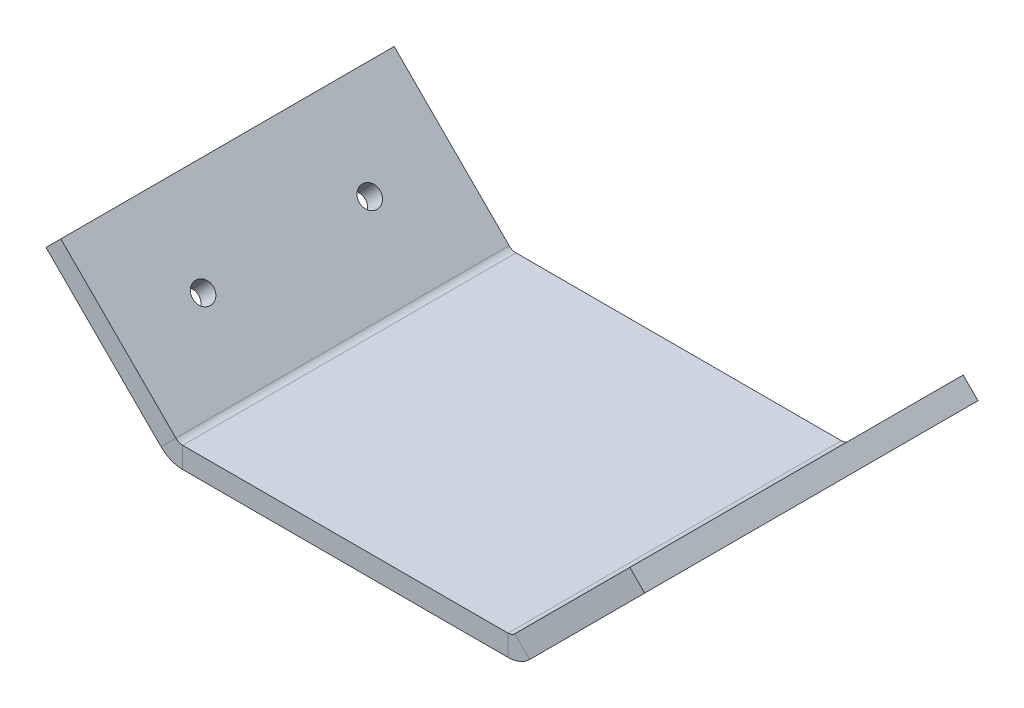
ISO-10303-21;
HEADER;
FILE_DESCRIPTION(('STEP AP214'),'2;1');
FILE_NAME('part.step','',(''),(''),'','','');
FILE_SCHEMA(('AUTOMOTIVE_DESIGN { 1 0 10303 214 1 1 1 1 }'));
ENDSEC;
DATA;
#1=APPLICATION_CONTEXT('core data for automotive mechanical design processes');
#2=APPLICATION_PROTOCOL_DEFINITION('international standard','automotive_design',2000,#1);
#3=PRODUCT_CONTEXT('',#1,'mechanical');
#4=PRODUCT('Part','Part','',(#3));
#5=PRODUCT_RELATED_PRODUCT_CATEGORY('part','',(#4));
#6=PRODUCT_DEFINITION_FORMATION('','',#4);
#7=PRODUCT_DEFINITION_CONTEXT('part definition',#1,'design');
#8=PRODUCT_DEFINITION('design','',#6,#7);
#9=PRODUCT_DEFINITION_SHAPE('','',#8);
#10=(LENGTH_UNIT() NAMED_UNIT(*) SI_UNIT(.MILLI.,.METRE.));
#11=(NAMED_UNIT(*) PLANE_ANGLE_UNIT() SI_UNIT($,.RADIAN.));
#12=(NAMED_UNIT(*) SI_UNIT($,.STERADIAN.) SOLID_ANGLE_UNIT());
#13=UNCERTAINTY_MEASURE_WITH_UNIT(LENGTH_MEASURE(1.E-05),#10,'distance_accuracy_value','');
#14=(GEOMETRIC_REPRESENTATION_CONTEXT(3) GLOBAL_UNCERTAINTY_ASSIGNED_CONTEXT((#13)) GLOBAL_UNIT_ASSIGNED_CONTEXT((#10,
#11,#12)) REPRESENTATION_CONTEXT('',''));
#15=CARTESIAN_POINT('',(0.,0.,0.));
#16=DIRECTION('',(0.,0.,1.));
#17=DIRECTION('',(1.,0.,0.));
#18=AXIS2_PLACEMENT_3D('',#15,#16,#17);
#19=CARTESIAN_POINT('',(-12.7,1.6002,12.7));
#20=DIRECTION('',(0.,0.,-1.));
#21=DIRECTION('',(-1.,0.,0.));
#22=AXIS2_PLACEMENT_3D('',#19,#20,#21);
#23=PLANE('',#22);
#24=DIRECTION('',(0.,-1.,0.));
#25=VECTOR('',#24,1.);
#26=CARTESIAN_POINT('',(-12.394890289956,1.60020000000001,12.7));
#27=LINE('',#26,#25);
#28=CARTESIAN_POINT('',(-12.394890289956,1.6002,12.7));
#29=VERTEX_POINT('',#28);
#30=CARTESIAN_POINT('',(-12.394890289956,0.,12.7));
#31=VERTEX_POINT('',#30);
#32=EDGE_CURVE('E177',#29,#31,#27,.T.);
#33=ORIENTED_EDGE('',*,*,#32,.T.);
#34=DIRECTION('',(1.,0.,0.));
#35=VECTOR('',#34,1.);
#36=CARTESIAN_POINT('',(-12.7,0.,12.7));
#37=LINE('',#36,#35);
#38=CARTESIAN_POINT('',(12.394890289956,0.,12.7));
#39=VERTEX_POINT('',#38);
#40=EDGE_CURVE('E237',#31,#39,#37,.T.);
#41=ORIENTED_EDGE('',*,*,#40,.T.);
#42=DIRECTION('',(0.,-1.,0.));
#43=VECTOR('',#42,1.);
#44=CARTESIAN_POINT('',(12.394890289956,1.6002,12.7));
#45=LINE('',#44,#43);
#46=CARTESIAN_POINT('',(12.394890289956,1.6002,12.7));
#47=VERTEX_POINT('',#46);
#48=EDGE_CURVE('E234',#47,#39,#45,.T.);
#49=ORIENTED_EDGE('',*,*,#48,.F.);
#50=DIRECTION('',(1.,0.,0.));
#51=VECTOR('',#50,1.);
#52=CARTESIAN_POINT('',(-12.7,1.6002,12.7));
#53=LINE('',#52,#51);
#54=EDGE_CURVE('E41',#29,#47,#53,.T.);
#55=ORIENTED_EDGE('',*,*,#54,.F.);
#56=EDGE_LOOP('',(#33,#41,#49,#55));
#57=FACE_BOUND('',#56,.T.);
#58=ADVANCED_FACE('F33',(#57),#23,.F.);
#59=CARTESIAN_POINT('',(-12.7,1.6002,-12.7));
#60=DIRECTION('',(0.,0.,1.));
#61=DIRECTION('',(1.,0.,0.));
#62=AXIS2_PLACEMENT_3D('',#59,#60,#61);
#63=PLANE('',#62);
#64=DIRECTION('',(0.,-1.,0.));
#65=VECTOR('',#64,1.);
#66=CARTESIAN_POINT('',(-12.394890289956,1.6002,-12.7));
#67=LINE('',#66,#65);
#68=CARTESIAN_POINT('',(-12.394890289956,1.6002,-12.7));
#69=VERTEX_POINT('',#68);
#70=CARTESIAN_POINT('',(-12.394890289956,0.,-12.7));
#71=VERTEX_POINT('',#70);
#72=EDGE_CURVE('E49',#69,#71,#67,.T.);
#73=ORIENTED_EDGE('',*,*,#72,.F.);
#74=DIRECTION('',(-1.,0.,0.));
#75=VECTOR('',#74,1.);
#76=CARTESIAN_POINT('',(-12.7,1.6002,-12.7));
#77=LINE('',#76,#75);
#78=CARTESIAN_POINT('',(12.394890289956,1.6002,-12.7));
#79=VERTEX_POINT('',#78);
#80=EDGE_CURVE('E11',#79,#69,#77,.T.);
#81=ORIENTED_EDGE('',*,*,#80,.F.);
#82=DIRECTION('',(0.,-1.,0.));
#83=VECTOR('',#82,1.);
#84=CARTESIAN_POINT('',(12.394890289956,1.6002,-12.7));
#85=LINE('',#84,#83);
#86=CARTESIAN_POINT('',(12.394890289956,0.,-12.7));
#87=VERTEX_POINT('',#86);
#88=EDGE_CURVE('E223',#79,#87,#85,.T.);
#89=ORIENTED_EDGE('',*,*,#88,.T.);
#90=DIRECTION('',(-1.,0.,0.));
#91=VECTOR('',#90,1.);
#92=CARTESIAN_POINT('',(-12.7,0.,-12.7));
#93=LINE('',#92,#91);
#94=EDGE_CURVE('E36',#87,#71,#93,.T.);
#95=ORIENTED_EDGE('',*,*,#94,.T.);
#96=EDGE_LOOP('',(#73,#81,#89,#95));
#97=FACE_BOUND('',#96,.T.);
#98=ADVANCED_FACE('F243',(#97),#63,.F.);
#99=CARTESIAN_POINT('',(-12.7,1.6002,12.7));
#100=DIRECTION('',(0.,1.,0.));
#101=DIRECTION('',(0.,0.,1.));
#102=AXIS2_PLACEMENT_3D('',#99,#100,#101);
#103=PLANE('',#102);
#104=ORIENTED_EDGE('',*,*,#80,.T.);
#105=DIRECTION('',(0.,0.,1.));
#106=VECTOR('',#105,1.);
#107=CARTESIAN_POINT('',(-12.394890289956,1.60020000000001,12.7));
#108=LINE('',#107,#106);
#109=EDGE_CURVE('E55',#29,#69,#108,.F.);
#110=ORIENTED_EDGE('',*,*,#109,.F.);
#111=ORIENTED_EDGE('',*,*,#54,.T.);
#112=DIRECTION('',(0.,0.,-1.));
#113=VECTOR('',#112,1.);
#114=CARTESIAN_POINT('',(12.394890289956,1.6002,-12.7));
#115=LINE('',#114,#113);
#116=EDGE_CURVE('E229',#79,#47,#115,.F.);
#117=ORIENTED_EDGE('',*,*,#116,.F.);
#118=EDGE_LOOP('',(#104,#110,#111,#117));
#119=FACE_BOUND('',#118,.T.);
#120=ADVANCED_FACE('F282',(#119),#103,.T.);
#121=CARTESIAN_POINT('',(-12.7,0.,12.7));
#122=DIRECTION('',(0.,1.,0.));
#123=DIRECTION('',(0.,0.,1.));
#124=AXIS2_PLACEMENT_3D('',#121,#122,#123);
#125=PLANE('',#124);
#126=DIRECTION('',(0.,0.,1.));
#127=VECTOR('',#126,1.);
#128=CARTESIAN_POINT('',(-12.394890289956,0.,12.7));
#129=LINE('',#128,#127);
#130=EDGE_CURVE('E131',#31,#71,#129,.F.);
#131=ORIENTED_EDGE('',*,*,#130,.T.);
#132=ORIENTED_EDGE('',*,*,#94,.F.);
#133=DIRECTION('',(0.,0.,-1.));
#134=VECTOR('',#133,1.);
#135=CARTESIAN_POINT('',(12.394890289956,0.,-12.7));
#136=LINE('',#135,#134);
#137=EDGE_CURVE('E216',#87,#39,#136,.F.);
#138=ORIENTED_EDGE('',*,*,#137,.T.);
#139=ORIENTED_EDGE('',*,*,#40,.F.);
#140=EDGE_LOOP('',(#131,#132,#138,#139));
#141=FACE_BOUND('',#140,.T.);
#142=ADVANCED_FACE('F283',(#141),#125,.F.);
#143=CARTESIAN_POINT('',(12.394890289956,2.3368,12.7));
#144=DIRECTION('',(0.,0.,1.));
#145=DIRECTION('',(1.,0.,0.));
#146=AXIS2_PLACEMENT_3D('',#143,#144,#145);
#147=PLANE('',#146);
#148=DIRECTION('',(0.707106781186544,-0.707106781186551,0.));
#149=VECTOR('',#148,1.);
#150=CARTESIAN_POINT('',(12.915745144978,1.81594514497799,12.7));
#151=LINE('',#150,#149);
#152=CARTESIAN_POINT('',(12.915745144978,1.81594514497799,12.7));
#153=VERTEX_POINT('',#152);
#154=CARTESIAN_POINT('',(14.0472574162327,0.684432873723268,12.7));
#155=VERTEX_POINT('',#154);
#156=EDGE_CURVE('E184',#153,#155,#151,.T.);
#157=ORIENTED_EDGE('',*,*,#156,.F.);
#158=CARTESIAN_POINT('',(12.394890289956,2.3368,12.7));
#159=DIRECTION('',(0.,0.,-1.));
#160=DIRECTION('',(-1.,0.,0.));
#161=AXIS2_PLACEMENT_3D('',#158,#159,#160);
#162=CIRCLE('',#161,0.736599999999999);
#163=EDGE_CURVE('E226',#47,#153,#162,.F.);
#164=ORIENTED_EDGE('',*,*,#163,.F.);
#165=ORIENTED_EDGE('',*,*,#48,.T.);
#166=CARTESIAN_POINT('',(12.394890289956,2.3368,12.7));
#167=DIRECTION('',(0.,0.,-1.));
#168=DIRECTION('',(-1.,0.,0.));
#169=AXIS2_PLACEMENT_3D('',#166,#167,#168);
#170=CIRCLE('',#169,2.3368);
#171=EDGE_CURVE('E219',#39,#155,#170,.F.);
#172=ORIENTED_EDGE('',*,*,#171,.T.);
#173=EDGE_LOOP('',(#157,#164,#165,#172));
#174=FACE_BOUND('',#173,.T.);
#175=ADVANCED_FACE('F288',(#174),#147,.T.);
#176=CARTESIAN_POINT('',(12.394890289956,2.3368,-12.7));
#177=DIRECTION('',(0.,0.,1.));
#178=DIRECTION('',(1.,0.,0.));
#179=AXIS2_PLACEMENT_3D('',#176,#177,#178);
#180=PLANE('',#179);
#181=CARTESIAN_POINT('',(12.394890289956,2.3368,-12.7));
#182=DIRECTION('',(0.,0.,-1.));
#183=DIRECTION('',(-1.,0.,0.));
#184=AXIS2_PLACEMENT_3D('',#181,#182,#183);
#185=CIRCLE('',#184,0.736599999999999);
#186=CARTESIAN_POINT('',(12.915745144978,1.81594514497799,-12.7));
#187=VERTEX_POINT('',#186);
#188=EDGE_CURVE('E215',#187,#79,#185,.T.);
#189=ORIENTED_EDGE('',*,*,#188,.F.);
#190=DIRECTION('',(0.707106781186544,-0.707106781186551,0.));
#191=VECTOR('',#190,1.);
#192=CARTESIAN_POINT('',(12.915745144978,1.81594514497799,-12.7));
#193=LINE('',#192,#191);
#194=CARTESIAN_POINT('',(14.0472574162327,0.684432873723268,-12.7));
#195=VERTEX_POINT('',#194);
#196=EDGE_CURVE('E188',#187,#195,#193,.T.);
#197=ORIENTED_EDGE('',*,*,#196,.T.);
#198=CARTESIAN_POINT('',(12.394890289956,2.3368,-12.7));
#199=DIRECTION('',(0.,0.,-1.));
#200=DIRECTION('',(-1.,0.,0.));
#201=AXIS2_PLACEMENT_3D('',#198,#199,#200);
#202=CIRCLE('',#201,2.3368);
#203=EDGE_CURVE('E220',#195,#87,#202,.T.);
#204=ORIENTED_EDGE('',*,*,#203,.T.);
#205=ORIENTED_EDGE('',*,*,#88,.F.);
#206=EDGE_LOOP('',(#189,#197,#204,#205));
#207=FACE_BOUND('',#206,.T.);
#208=ADVANCED_FACE('F334',(#207),#180,.F.);
#209=CARTESIAN_POINT('',(12.394890289956,2.3368,-12.7));
#210=DIRECTION('',(0.,0.,-1.));
#211=DIRECTION('',(0.707106781186544,-0.707106781186551,0.));
#212=AXIS2_PLACEMENT_3D('',#209,#210,#211);
#213=CYLINDRICAL_SURFACE('',#212,2.3368);
#214=ORIENTED_EDGE('',*,*,#137,.F.);
#215=ORIENTED_EDGE('',*,*,#203,.F.);
#216=DIRECTION('',(0.,0.,1.));
#217=VECTOR('',#216,1.);
#218=CARTESIAN_POINT('',(14.0472574162327,0.684432873723268,-12.7));
#219=LINE('',#218,#217);
#220=EDGE_CURVE('E191',#195,#155,#219,.T.);
#221=ORIENTED_EDGE('',*,*,#220,.T.);
#222=ORIENTED_EDGE('',*,*,#171,.F.);
#223=EDGE_LOOP('',(#214,#215,#221,#222));
#224=FACE_BOUND('',#223,.T.);
#225=ADVANCED_FACE('F289',(#224),#213,.T.);
#226=CARTESIAN_POINT('',(12.394890289956,2.3368,-12.7));
#227=DIRECTION('',(0.,0.,-1.));
#228=DIRECTION('',(0.707106781186544,-0.707106781186551,0.));
#229=AXIS2_PLACEMENT_3D('',#226,#227,#228);
#230=CYLINDRICAL_SURFACE('',#229,0.736599999999999);
#231=ORIENTED_EDGE('',*,*,#116,.T.);
#232=ORIENTED_EDGE('',*,*,#163,.T.);
#233=DIRECTION('',(0.,0.,-1.));
#234=VECTOR('',#233,1.);
#235=CARTESIAN_POINT('',(12.915745144978,1.81594514497799,12.7));
#236=LINE('',#235,#234);
#237=EDGE_CURVE('E186',#153,#187,#236,.T.);
#238=ORIENTED_EDGE('',*,*,#237,.T.);
#239=ORIENTED_EDGE('',*,*,#188,.T.);
#240=EDGE_LOOP('',(#231,#232,#238,#239));
#241=FACE_BOUND('',#240,.T.);
#242=ADVANCED_FACE('F310',(#241),#230,.F.);
#243=CARTESIAN_POINT('',(22.8117683923239,9.44894384981439,-12.7));
#244=DIRECTION('',(0.,0.,1.));
#245=DIRECTION('',(1.,0.,0.));
#246=AXIS2_PLACEMENT_3D('',#243,#244,#245);
#247=PLANE('',#246);
#248=ORIENTED_EDGE('',*,*,#196,.F.);
#249=DIRECTION('',(0.707106781186551,0.707106781186544,0.));
#250=VECTOR('',#249,1.);
#251=CARTESIAN_POINT('',(21.6802561210692,10.5804561210691,-12.7));
#252=LINE('',#251,#250);
#253=CARTESIAN_POINT('',(21.6802561210692,10.5804561210691,-12.7));
#254=VERTEX_POINT('',#253);
#255=EDGE_CURVE('E195',#187,#254,#252,.T.);
#256=ORIENTED_EDGE('',*,*,#255,.T.);
#257=DIRECTION('',(-0.707106781186544,0.707106781186551,0.));
#258=VECTOR('',#257,1.);
#259=CARTESIAN_POINT('',(22.8117683923239,9.44894384981439,-12.7));
#260=LINE('',#259,#258);
#261=CARTESIAN_POINT('',(22.8117683923239,9.44894384981439,-12.7));
#262=VERTEX_POINT('',#261);
#263=EDGE_CURVE('E212',#262,#254,#260,.T.);
#264=ORIENTED_EDGE('',*,*,#263,.F.);
#265=DIRECTION('',(0.707106781186551,0.707106781186544,0.));
#266=VECTOR('',#265,1.);
#267=CARTESIAN_POINT('',(22.8117683923239,9.44894384981439,-12.7));
#268=LINE('',#267,#266);
#269=EDGE_CURVE('E196',#195,#262,#268,.T.);
#270=ORIENTED_EDGE('',*,*,#269,.F.);
#271=EDGE_LOOP('',(#248,#256,#264,#270));
#272=FACE_BOUND('',#271,.T.);
#273=ADVANCED_FACE('F298',(#272),#247,.F.);
#274=CARTESIAN_POINT('',(13.8315122712547,0.468687728745282,12.7));
#275=DIRECTION('',(0.,0.,-1.));
#276=DIRECTION('',(-1.,0.,0.));
#277=AXIS2_PLACEMENT_3D('',#274,#275,#276);
#278=PLANE('',#277);
#279=ORIENTED_EDGE('',*,*,#156,.T.);
#280=DIRECTION('',(-0.707106781186551,-0.707106781186544,0.));
#281=VECTOR('',#280,1.);
#282=CARTESIAN_POINT('',(13.8315122712547,0.468687728745282,12.7));
#283=LINE('',#282,#281);
#284=CARTESIAN_POINT('',(22.8117683923239,9.44894384981439,12.7));
#285=VERTEX_POINT('',#284);
#286=EDGE_CURVE('E201',#285,#155,#283,.T.);
#287=ORIENTED_EDGE('',*,*,#286,.F.);
#288=DIRECTION('',(-0.707106781186544,0.707106781186551,0.));
#289=VECTOR('',#288,1.);
#290=CARTESIAN_POINT('',(22.8117683923239,9.44894384981439,12.7));
#291=LINE('',#290,#289);
#292=CARTESIAN_POINT('',(21.6802561210692,10.5804561210691,12.7));
#293=VERTEX_POINT('',#292);
#294=EDGE_CURVE('E204',#285,#293,#291,.T.);
#295=ORIENTED_EDGE('',*,*,#294,.T.);
#296=DIRECTION('',(-0.707106781186551,-0.707106781186544,0.));
#297=VECTOR('',#296,1.);
#298=CARTESIAN_POINT('',(12.7,1.6002,12.7));
#299=LINE('',#298,#297);
#300=EDGE_CURVE('E199',#293,#153,#299,.T.);
#301=ORIENTED_EDGE('',*,*,#300,.T.);
#302=EDGE_LOOP('',(#279,#287,#295,#301));
#303=FACE_BOUND('',#302,.T.);
#304=ADVANCED_FACE('F307',(#303),#278,.F.);
#305=CARTESIAN_POINT('',(13.8315122712547,0.46868772874528,-12.7));
#306=DIRECTION('',(-0.707106781186544,0.707106781186551,0.));
#307=DIRECTION('',(-0.707106781186551,-0.707106781186544,0.));
#308=AXIS2_PLACEMENT_3D('',#305,#306,#307);
#309=PLANE('',#308);
#310=CARTESIAN_POINT('',(18.3216403317893,4.95881578927983,-6.35));
#311=DIRECTION('',(-0.707106781186544,0.707106781186551,0.));
#312=DIRECTION('',(-0.707106781186551,-0.707106781186544,0.));
#313=AXIS2_PLACEMENT_3D('',#310,#311,#312);
#314=CIRCLE('',#313,0.793749999999992);
#315=CARTESIAN_POINT('',(17.7603743242225,4.39754978171302,-6.35));
#316=VERTEX_POINT('',#315);
#317=EDGE_CURVE('E448',#316,#316,#314,.T.);
#318=ORIENTED_EDGE('',*,*,#317,.T.);
#319=EDGE_LOOP('',(#318));
#320=FACE_BOUND('',#319,.T.);
#321=CARTESIAN_POINT('',(18.3216403317893,4.95881578927983,6.35));
#322=DIRECTION('',(-0.707106781186544,0.707106781186551,0.));
#323=DIRECTION('',(-0.707106781186551,-0.707106781186544,0.));
#324=AXIS2_PLACEMENT_3D('',#321,#322,#323);
#325=CIRCLE('',#324,0.793749999999992);
#326=CARTESIAN_POINT('',(17.7603743242225,4.39754978171302,6.35));
#327=VERTEX_POINT('',#326);
#328=EDGE_CURVE('E442',#327,#327,#325,.T.);
#329=ORIENTED_EDGE('',*,*,#328,.T.);
#330=EDGE_LOOP('',(#329));
#331=FACE_BOUND('',#330,.T.);
#332=ORIENTED_EDGE('',*,*,#220,.F.);
#333=ORIENTED_EDGE('',*,*,#269,.T.);
#334=DIRECTION('',(0.,0.,1.));
#335=VECTOR('',#334,1.);
#336=CARTESIAN_POINT('',(22.8117683923239,9.44894384981439,12.7));
#337=LINE('',#336,#335);
#338=EDGE_CURVE('E198',#262,#285,#337,.T.);
#339=ORIENTED_EDGE('',*,*,#338,.T.);
#340=ORIENTED_EDGE('',*,*,#286,.T.);
#341=EDGE_LOOP('',(#332,#333,#339,#340));
#342=FACE_BOUND('',#341,.T.);
#343=ADVANCED_FACE('F293',(#320,#331,#342),#309,.F.);
#344=CARTESIAN_POINT('',(12.7,1.6002,-12.7));
#345=DIRECTION('',(-0.707106781186544,0.707106781186551,0.));
#346=DIRECTION('',(-0.707106781186551,-0.707106781186544,0.));
#347=AXIS2_PLACEMENT_3D('',#344,#345,#346);
#348=PLANE('',#347);
#349=CARTESIAN_POINT('',(17.1901280605346,6.09032806053455,-6.35));
#350=DIRECTION('',(-0.707106781186544,0.707106781186551,0.));
#351=DIRECTION('',(-0.707106781186551,-0.707106781186544,0.));
#352=AXIS2_PLACEMENT_3D('',#349,#350,#351);
#353=CIRCLE('',#352,0.793749999999987);
#354=CARTESIAN_POINT('',(16.6288620529678,5.52906205296774,-6.35));
#355=VERTEX_POINT('',#354);
#356=EDGE_CURVE('E451',#355,#355,#353,.T.);
#357=ORIENTED_EDGE('',*,*,#356,.F.);
#358=EDGE_LOOP('',(#357));
#359=FACE_BOUND('',#358,.T.);
#360=CARTESIAN_POINT('',(17.1901280605346,6.09032806053455,6.35));
#361=DIRECTION('',(-0.707106781186544,0.707106781186551,0.));
#362=DIRECTION('',(-0.707106781186551,-0.707106781186544,0.));
#363=AXIS2_PLACEMENT_3D('',#360,#361,#362);
#364=CIRCLE('',#363,0.793749999999987);
#365=CARTESIAN_POINT('',(16.6288620529678,5.52906205296774,6.35));
#366=VERTEX_POINT('',#365);
#367=EDGE_CURVE('E445',#366,#366,#364,.T.);
#368=ORIENTED_EDGE('',*,*,#367,.F.);
#369=EDGE_LOOP('',(#368));
#370=FACE_BOUND('',#369,.T.);
#371=ORIENTED_EDGE('',*,*,#255,.F.);
#372=ORIENTED_EDGE('',*,*,#237,.F.);
#373=ORIENTED_EDGE('',*,*,#300,.F.);
#374=DIRECTION('',(0.,0.,1.));
#375=VECTOR('',#374,1.);
#376=CARTESIAN_POINT('',(21.6802561210692,10.5804561210691,12.7));
#377=LINE('',#376,#375);
#378=EDGE_CURVE('E206',#254,#293,#377,.T.);
#379=ORIENTED_EDGE('',*,*,#378,.F.);
#380=EDGE_LOOP('',(#371,#372,#373,#379));
#381=FACE_BOUND('',#380,.T.);
#382=ADVANCED_FACE('F313',(#359,#370,#381),#348,.T.);
#383=CARTESIAN_POINT('',(22.8117683923239,9.44894384981439,12.7));
#384=DIRECTION('',(-0.707106781186551,-0.707106781186544,0.));
#385=DIRECTION('',(0.707106781186544,-0.707106781186551,0.));
#386=AXIS2_PLACEMENT_3D('',#383,#384,#385);
#387=PLANE('',#386);
#388=ORIENTED_EDGE('',*,*,#378,.T.);
#389=ORIENTED_EDGE('',*,*,#294,.F.);
#390=ORIENTED_EDGE('',*,*,#338,.F.);
#391=ORIENTED_EDGE('',*,*,#263,.T.);
#392=EDGE_LOOP('',(#388,#389,#390,#391));
#393=FACE_BOUND('',#392,.T.);
#394=ADVANCED_FACE('F304',(#393),#387,.F.);
#395=CARTESIAN_POINT('',(-12.394890289956,2.3368,-12.7));
#396=DIRECTION('',(0.,0.,-1.));
#397=DIRECTION('',(0.,1.,0.));
#398=AXIS2_PLACEMENT_3D('',#395,#396,#397);
#399=PLANE('',#398);
#400=DIRECTION('',(-0.707106781186544,-0.707106781186551,0.));
#401=VECTOR('',#400,1.);
#402=CARTESIAN_POINT('',(-12.915745144978,1.81594514497799,-12.7));
#403=LINE('',#402,#401);
#404=CARTESIAN_POINT('',(-12.915745144978,1.81594514497799,-12.7));
#405=VERTEX_POINT('',#404);
#406=CARTESIAN_POINT('',(-14.0472574162327,0.684432873723267,-12.7));
#407=VERTEX_POINT('',#406);
#408=EDGE_CURVE('E251',#405,#407,#403,.T.);
#409=ORIENTED_EDGE('',*,*,#408,.F.);
#410=CARTESIAN_POINT('',(-12.394890289956,2.3368,-12.7));
#411=DIRECTION('',(0.,0.,1.));
#412=DIRECTION('',(0.,-1.,0.));
#413=AXIS2_PLACEMENT_3D('',#410,#411,#412);
#414=CIRCLE('',#413,0.736599999999997);
#415=EDGE_CURVE('E134',#69,#405,#414,.F.);
#416=ORIENTED_EDGE('',*,*,#415,.F.);
#417=ORIENTED_EDGE('',*,*,#72,.T.);
#418=CARTESIAN_POINT('',(-12.394890289956,2.3368,-12.7));
#419=DIRECTION('',(0.,0.,1.));
#420=DIRECTION('',(0.,-1.,0.));
#421=AXIS2_PLACEMENT_3D('',#418,#419,#420);
#422=CIRCLE('',#421,2.3368);
#423=EDGE_CURVE('E176',#71,#407,#422,.F.);
#424=ORIENTED_EDGE('',*,*,#423,.T.);
#425=EDGE_LOOP('',(#409,#416,#417,#424));
#426=FACE_BOUND('',#425,.T.);
#427=ADVANCED_FACE('F249',(#426),#399,.T.);
#428=CARTESIAN_POINT('',(-12.394890289956,2.3368,12.7));
#429=DIRECTION('',(0.,0.,-1.));
#430=DIRECTION('',(0.,1.,0.));
#431=AXIS2_PLACEMENT_3D('',#428,#429,#430);
#432=PLANE('',#431);
#433=CARTESIAN_POINT('',(-12.394890289956,2.3368,12.7));
#434=DIRECTION('',(0.,0.,1.));
#435=DIRECTION('',(0.,-1.,0.));
#436=AXIS2_PLACEMENT_3D('',#433,#434,#435);
#437=CIRCLE('',#436,0.736599999999997);
#438=CARTESIAN_POINT('',(-12.915745144978,1.81594514497799,12.7));
#439=VERTEX_POINT('',#438);
#440=EDGE_CURVE('E141',#439,#29,#437,.T.);
#441=ORIENTED_EDGE('',*,*,#440,.F.);
#442=DIRECTION('',(-0.707106781186544,-0.707106781186551,0.));
#443=VECTOR('',#442,1.);
#444=CARTESIAN_POINT('',(-12.915745144978,1.81594514497799,12.7));
#445=LINE('',#444,#443);
#446=CARTESIAN_POINT('',(-14.0472574162327,0.68443287372327,12.7));
#447=VERTEX_POINT('',#446);
#448=EDGE_CURVE('E138',#439,#447,#445,.T.);
#449=ORIENTED_EDGE('',*,*,#448,.T.);
#450=CARTESIAN_POINT('',(-12.394890289956,2.3368,12.7));
#451=DIRECTION('',(0.,0.,1.));
#452=DIRECTION('',(0.,-1.,0.));
#453=AXIS2_PLACEMENT_3D('',#450,#451,#452);
#454=CIRCLE('',#453,2.3368);
#455=EDGE_CURVE('E124',#447,#31,#454,.T.);
#456=ORIENTED_EDGE('',*,*,#455,.T.);
#457=ORIENTED_EDGE('',*,*,#32,.F.);
#458=EDGE_LOOP('',(#441,#449,#456,#457));
#459=FACE_BOUND('',#458,.T.);
#460=ADVANCED_FACE('F139',(#459),#432,.F.);
#461=CARTESIAN_POINT('',(-12.394890289956,2.3368,12.7));
#462=DIRECTION('',(0.,0.,1.));
#463=DIRECTION('',(-0.707106781186544,-0.707106781186551,0.));
#464=AXIS2_PLACEMENT_3D('',#461,#462,#463);
#465=CYLINDRICAL_SURFACE('',#464,2.3368);
#466=ORIENTED_EDGE('',*,*,#130,.F.);
#467=ORIENTED_EDGE('',*,*,#455,.F.);
#468=DIRECTION('',(0.,0.,-1.));
#469=VECTOR('',#468,1.);
#470=CARTESIAN_POINT('',(-14.0472574162327,0.684432873723266,-12.7));
#471=LINE('',#470,#469);
#472=EDGE_CURVE('E129',#447,#407,#471,.T.);
#473=ORIENTED_EDGE('',*,*,#472,.T.);
#474=ORIENTED_EDGE('',*,*,#423,.F.);
#475=EDGE_LOOP('',(#466,#467,#473,#474));
#476=FACE_BOUND('',#475,.T.);
#477=ADVANCED_FACE('F126',(#476),#465,.T.);
#478=CARTESIAN_POINT('',(-12.394890289956,2.3368,12.7));
#479=DIRECTION('',(0.,0.,1.));
#480=DIRECTION('',(-0.707106781186544,-0.707106781186551,0.));
#481=AXIS2_PLACEMENT_3D('',#478,#479,#480);
#482=CYLINDRICAL_SURFACE('',#481,0.736599999999997);
#483=ORIENTED_EDGE('',*,*,#109,.T.);
#484=ORIENTED_EDGE('',*,*,#415,.T.);
#485=DIRECTION('',(0.,0.,1.));
#486=VECTOR('',#485,1.);
#487=CARTESIAN_POINT('',(-12.915745144978,1.81594514497799,-12.7));
#488=LINE('',#487,#486);
#489=EDGE_CURVE('E145',#405,#439,#488,.T.);
#490=ORIENTED_EDGE('',*,*,#489,.T.);
#491=ORIENTED_EDGE('',*,*,#440,.T.);
#492=EDGE_LOOP('',(#483,#484,#490,#491));
#493=FACE_BOUND('',#492,.T.);
#494=ADVANCED_FACE('F254',(#493),#482,.F.);
#495=CARTESIAN_POINT('',(-13.8315122712547,0.468687728745282,-12.7));
#496=DIRECTION('',(0.,0.,1.));
#497=DIRECTION('',(1.,0.,0.));
#498=AXIS2_PLACEMENT_3D('',#495,#496,#497);
#499=PLANE('',#498);
#500=ORIENTED_EDGE('',*,*,#408,.T.);
#501=DIRECTION('',(0.707106781186551,-0.707106781186544,0.));
#502=VECTOR('',#501,1.);
#503=CARTESIAN_POINT('',(-13.8315122712547,0.468687728745282,-12.7));
#504=LINE('',#503,#502);
#505=CARTESIAN_POINT('',(-22.8117683923239,9.44894384981439,-12.7));
#506=VERTEX_POINT('',#505);
#507=EDGE_CURVE('E153',#506,#407,#504,.T.);
#508=ORIENTED_EDGE('',*,*,#507,.F.);
#509=DIRECTION('',(0.707106781186544,0.707106781186551,0.));
#510=VECTOR('',#509,1.);
#511=CARTESIAN_POINT('',(-22.8117683923239,9.44894384981439,-12.7));
#512=LINE('',#511,#510);
#513=CARTESIAN_POINT('',(-21.6802561210692,10.5804561210691,-12.7));
#514=VERTEX_POINT('',#513);
#515=EDGE_CURVE('E162',#506,#514,#512,.T.);
#516=ORIENTED_EDGE('',*,*,#515,.T.);
#517=DIRECTION('',(0.707106781186551,-0.707106781186544,0.));
#518=VECTOR('',#517,1.);
#519=CARTESIAN_POINT('',(-12.7,1.6002,-12.7));
#520=LINE('',#519,#518);
#521=EDGE_CURVE('E154',#514,#405,#520,.T.);
#522=ORIENTED_EDGE('',*,*,#521,.T.);
#523=EDGE_LOOP('',(#500,#508,#516,#522));
#524=FACE_BOUND('',#523,.T.);
#525=ADVANCED_FACE('F261',(#524),#499,.F.);
#526=CARTESIAN_POINT('',(-22.8117683923239,9.44894384981439,12.7));
#527=DIRECTION('',(0.,0.,-1.));
#528=DIRECTION('',(-1.,0.,0.));
#529=AXIS2_PLACEMENT_3D('',#526,#527,#528);
#530=PLANE('',#529);
#531=ORIENTED_EDGE('',*,*,#448,.F.);
#532=DIRECTION('',(-0.707106781186551,0.707106781186544,0.));
#533=VECTOR('',#532,1.);
#534=CARTESIAN_POINT('',(-21.6802561210692,10.5804561210691,12.7));
#535=LINE('',#534,#533);
#536=CARTESIAN_POINT('',(-21.6802561210692,10.5804561210691,12.7));
#537=VERTEX_POINT('',#536);
#538=EDGE_CURVE('E169',#439,#537,#535,.T.);
#539=ORIENTED_EDGE('',*,*,#538,.T.);
#540=DIRECTION('',(0.707106781186544,0.707106781186551,0.));
#541=VECTOR('',#540,1.);
#542=CARTESIAN_POINT('',(-22.8117683923239,9.44894384981439,12.7));
#543=LINE('',#542,#541);
#544=CARTESIAN_POINT('',(-22.8117683923239,9.44894384981439,12.7));
#545=VERTEX_POINT('',#544);
#546=EDGE_CURVE('E158',#545,#537,#543,.T.);
#547=ORIENTED_EDGE('',*,*,#546,.F.);
#548=DIRECTION('',(-0.707106781186551,0.707106781186544,0.));
#549=VECTOR('',#548,1.);
#550=CARTESIAN_POINT('',(-22.8117683923239,9.44894384981439,12.7));
#551=LINE('',#550,#549);
#552=EDGE_CURVE('E150',#447,#545,#551,.T.);
#553=ORIENTED_EDGE('',*,*,#552,.F.);
#554=EDGE_LOOP('',(#531,#539,#547,#553));
#555=FACE_BOUND('',#554,.T.);
#556=ADVANCED_FACE('F156',(#555),#530,.F.);
#557=CARTESIAN_POINT('',(-22.8117683923239,9.44894384981439,-12.7));
#558=DIRECTION('',(0.707106781186544,0.707106781186551,0.));
#559=DIRECTION('',(-0.707106781186551,0.707106781186544,0.));
#560=AXIS2_PLACEMENT_3D('',#557,#558,#559);
#561=PLANE('',#560);
#562=CARTESIAN_POINT('',(-18.3216403317893,4.95881578927983,-6.35));
#563=DIRECTION('',(0.707106781186544,0.707106781186551,0.));
#564=DIRECTION('',(-0.707106781186551,0.707106781186544,0.));
#565=AXIS2_PLACEMENT_3D('',#562,#563,#564);
#566=CIRCLE('',#565,0.793749999999992);
#567=CARTESIAN_POINT('',(-18.8829063393561,5.52008179684665,-6.35));
#568=VERTEX_POINT('',#567);
#569=EDGE_CURVE('E427',#568,#568,#566,.T.);
#570=ORIENTED_EDGE('',*,*,#569,.T.);
#571=EDGE_LOOP('',(#570));
#572=FACE_BOUND('',#571,.T.);
#573=CARTESIAN_POINT('',(-18.3216403317893,4.95881578927983,6.35));
#574=DIRECTION('',(0.707106781186544,0.707106781186551,0.));
#575=DIRECTION('',(-0.707106781186551,0.707106781186544,0.));
#576=AXIS2_PLACEMENT_3D('',#573,#574,#575);
#577=CIRCLE('',#576,0.793749999999992);
#578=CARTESIAN_POINT('',(-18.8829063393561,5.52008179684665,6.35));
#579=VERTEX_POINT('',#578);
#580=EDGE_CURVE('E430',#579,#579,#577,.T.);
#581=ORIENTED_EDGE('',*,*,#580,.T.);
#582=EDGE_LOOP('',(#581));
#583=FACE_BOUND('',#582,.T.);
#584=ORIENTED_EDGE('',*,*,#472,.F.);
#585=ORIENTED_EDGE('',*,*,#552,.T.);
#586=DIRECTION('',(0.,0.,-1.));
#587=VECTOR('',#586,1.);
#588=CARTESIAN_POINT('',(-22.8117683923239,9.44894384981439,-12.7));
#589=LINE('',#588,#587);
#590=EDGE_CURVE('E160',#545,#506,#589,.T.);
#591=ORIENTED_EDGE('',*,*,#590,.T.);
#592=ORIENTED_EDGE('',*,*,#507,.T.);
#593=EDGE_LOOP('',(#584,#585,#591,#592));
#594=FACE_BOUND('',#593,.T.);
#595=ADVANCED_FACE('F149',(#572,#583,#594),#561,.F.);
#596=CARTESIAN_POINT('',(-21.6802561210692,10.5804561210691,-12.7));
#597=DIRECTION('',(0.707106781186544,0.707106781186551,0.));
#598=DIRECTION('',(-0.707106781186551,0.707106781186544,0.));
#599=AXIS2_PLACEMENT_3D('',#596,#597,#598);
#600=PLANE('',#599);
#601=CARTESIAN_POINT('',(-17.1901280605346,6.09032806053456,-6.35));
#602=DIRECTION('',(0.707106781186544,0.707106781186551,0.));
#603=DIRECTION('',(-0.707106781186551,0.707106781186544,0.));
#604=AXIS2_PLACEMENT_3D('',#601,#602,#603);
#605=CIRCLE('',#604,0.793749999999987);
#606=CARTESIAN_POINT('',(-17.7513940681014,6.65159406810137,-6.35));
#607=VERTEX_POINT('',#606);
#608=EDGE_CURVE('E439',#607,#607,#605,.T.);
#609=ORIENTED_EDGE('',*,*,#608,.F.);
#610=EDGE_LOOP('',(#609));
#611=FACE_BOUND('',#610,.T.);
#612=CARTESIAN_POINT('',(-17.1901280605346,6.09032806053456,6.35));
#613=DIRECTION('',(0.707106781186544,0.707106781186551,0.));
#614=DIRECTION('',(-0.707106781186551,0.707106781186544,0.));
#615=AXIS2_PLACEMENT_3D('',#612,#613,#614);
#616=CIRCLE('',#615,0.793749999999987);
#617=CARTESIAN_POINT('',(-17.7513940681014,6.65159406810137,6.35));
#618=VERTEX_POINT('',#617);
#619=EDGE_CURVE('E432',#618,#618,#616,.T.);
#620=ORIENTED_EDGE('',*,*,#619,.F.);
#621=EDGE_LOOP('',(#620));
#622=FACE_BOUND('',#621,.T.);
#623=ORIENTED_EDGE('',*,*,#538,.F.);
#624=ORIENTED_EDGE('',*,*,#489,.F.);
#625=ORIENTED_EDGE('',*,*,#521,.F.);
#626=DIRECTION('',(0.,0.,-1.));
#627=VECTOR('',#626,1.);
#628=CARTESIAN_POINT('',(-21.6802561210692,10.5804561210691,-12.7));
#629=LINE('',#628,#627);
#630=EDGE_CURVE('E164',#537,#514,#629,.T.);
#631=ORIENTED_EDGE('',*,*,#630,.F.);
#632=EDGE_LOOP('',(#623,#624,#625,#631));
#633=FACE_BOUND('',#632,.T.);
#634=ADVANCED_FACE('F257',(#611,#622,#633),#600,.T.);
#635=CARTESIAN_POINT('',(-22.8117683923239,9.44894384981439,-12.7));
#636=DIRECTION('',(0.707106781186551,-0.707106781186544,0.));
#637=DIRECTION('',(0.707106781186544,0.707106781186551,0.));
#638=AXIS2_PLACEMENT_3D('',#635,#636,#637);
#639=PLANE('',#638);
#640=ORIENTED_EDGE('',*,*,#630,.T.);
#641=ORIENTED_EDGE('',*,*,#515,.F.);
#642=ORIENTED_EDGE('',*,*,#590,.F.);
#643=ORIENTED_EDGE('',*,*,#546,.T.);
#644=EDGE_LOOP('',(#640,#641,#642,#643));
#645=FACE_BOUND('',#644,.T.);
#646=ADVANCED_FACE('F264',(#645),#639,.F.);
#647=CARTESIAN_POINT('',(-17.1901280605346,6.09032806053456,6.35));
#648=DIRECTION('',(0.707106781186544,0.707106781186551,0.));
#649=DIRECTION('',(-0.707106781186551,0.707106781186544,0.));
#650=AXIS2_PLACEMENT_3D('',#647,#648,#649);
#651=CYLINDRICAL_SURFACE('',#650,0.793749999999992);
#652=ORIENTED_EDGE('',*,*,#619,.T.);
#653=EDGE_LOOP('',(#652));
#654=FACE_BOUND('',#653,.T.);
#655=ORIENTED_EDGE('',*,*,#580,.F.);
#656=EDGE_LOOP('',(#655));
#657=FACE_BOUND('',#656,.T.);
#658=ADVANCED_FACE('F266',(#654,#657),#651,.F.);
#659=CARTESIAN_POINT('',(-17.1901280605346,6.09032806053456,-6.35));
#660=DIRECTION('',(0.707106781186544,0.707106781186551,0.));
#661=DIRECTION('',(-0.707106781186551,0.707106781186544,0.));
#662=AXIS2_PLACEMENT_3D('',#659,#660,#661);
#663=CYLINDRICAL_SURFACE('',#662,0.793749999999992);
#664=ORIENTED_EDGE('',*,*,#608,.T.);
#665=EDGE_LOOP('',(#664));
#666=FACE_BOUND('',#665,.T.);
#667=ORIENTED_EDGE('',*,*,#569,.F.);
#668=EDGE_LOOP('',(#667));
#669=FACE_BOUND('',#668,.T.);
#670=ADVANCED_FACE('F272',(#666,#669),#663,.F.);
#671=CARTESIAN_POINT('',(17.1901280605346,6.09032806053455,6.35));
#672=DIRECTION('',(-0.707106781186544,0.707106781186551,0.));
#673=DIRECTION('',(-0.707106781186551,-0.707106781186544,0.));
#674=AXIS2_PLACEMENT_3D('',#671,#672,#673);
#675=CYLINDRICAL_SURFACE('',#674,0.793749999999992);
#676=ORIENTED_EDGE('',*,*,#367,.T.);
#677=EDGE_LOOP('',(#676));
#678=FACE_BOUND('',#677,.T.);
#679=ORIENTED_EDGE('',*,*,#328,.F.);
#680=EDGE_LOOP('',(#679));
#681=FACE_BOUND('',#680,.T.);
#682=ADVANCED_FACE('F395',(#678,#681),#675,.F.);
#683=CARTESIAN_POINT('',(17.1901280605346,6.09032806053455,-6.35));
#684=DIRECTION('',(-0.707106781186544,0.707106781186551,0.));
#685=DIRECTION('',(-0.707106781186551,-0.707106781186544,0.));
#686=AXIS2_PLACEMENT_3D('',#683,#684,#685);
#687=CYLINDRICAL_SURFACE('',#686,0.793749999999992);
#688=ORIENTED_EDGE('',*,*,#356,.T.);
#689=EDGE_LOOP('',(#688));
#690=FACE_BOUND('',#689,.T.);
#691=ORIENTED_EDGE('',*,*,#317,.F.);
#692=EDGE_LOOP('',(#691));
#693=FACE_BOUND('',#692,.T.);
#694=ADVANCED_FACE('F400',(#690,#693),#687,.F.);
#695=CLOSED_SHELL('',(#58,#98,#120,#142,#175,#208,#225,#242,#273,#304,#343,#382,#394,#427,#460,
#477,#494,#525,#556,#595,#634,#646,#658,#670,#682,#694));
#696=MANIFOLD_SOLID_BREP('B2',#695);
#697=ADVANCED_BREP_SHAPE_REPRESENTATION('',(#18,#696),#14);
#698=SHAPE_DEFINITION_REPRESENTATION(#9,#697);
ENDSEC;
END-ISO-10303-21;
